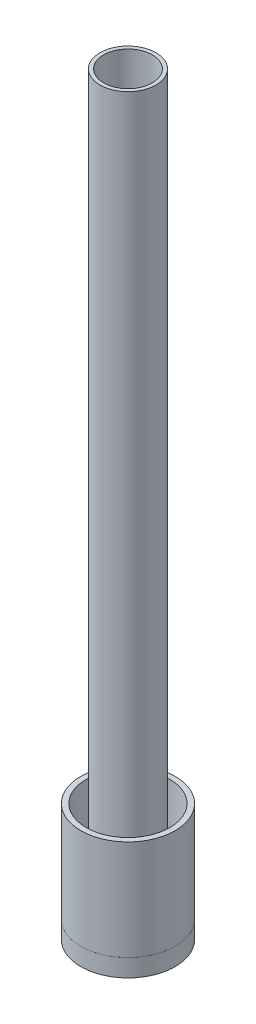
ISO-10303-21;
HEADER;
FILE_DESCRIPTION(('STEP AP214'),'2;1');
FILE_NAME('part.step','',(''),(''),'','','');
FILE_SCHEMA(('AUTOMOTIVE_DESIGN { 1 0 10303 214 1 1 1 1 }'));
ENDSEC;
DATA;
#1=APPLICATION_CONTEXT('core data for automotive mechanical design processes');
#2=APPLICATION_PROTOCOL_DEFINITION('international standard','automotive_design',2000,#1);
#3=PRODUCT_CONTEXT('',#1,'mechanical');
#4=PRODUCT('Part','Part','',(#3));
#5=PRODUCT_RELATED_PRODUCT_CATEGORY('part','',(#4));
#6=PRODUCT_DEFINITION_FORMATION('','',#4);
#7=PRODUCT_DEFINITION_CONTEXT('part definition',#1,'design');
#8=PRODUCT_DEFINITION('design','',#6,#7);
#9=PRODUCT_DEFINITION_SHAPE('','',#8);
#10=(LENGTH_UNIT() NAMED_UNIT(*) SI_UNIT(.MILLI.,.METRE.));
#11=(NAMED_UNIT(*) PLANE_ANGLE_UNIT() SI_UNIT($,.RADIAN.));
#12=(NAMED_UNIT(*) SI_UNIT($,.STERADIAN.) SOLID_ANGLE_UNIT());
#13=UNCERTAINTY_MEASURE_WITH_UNIT(LENGTH_MEASURE(1.E-05),#10,'distance_accuracy_value','');
#14=(GEOMETRIC_REPRESENTATION_CONTEXT(3) GLOBAL_UNCERTAINTY_ASSIGNED_CONTEXT((#13)) GLOBAL_UNIT_ASSIGNED_CONTEXT((#10,
#11,#12)) REPRESENTATION_CONTEXT('',''));
#15=CARTESIAN_POINT('',(0.,0.,0.));
#16=DIRECTION('',(0.,0.,1.));
#17=DIRECTION('',(1.,0.,0.));
#18=AXIS2_PLACEMENT_3D('',#15,#16,#17);
#19=CARTESIAN_POINT('',(-25.4,-67.0510410821472,0.));
#20=DIRECTION('',(0.,-1.,0.));
#21=DIRECTION('',(0.,0.,-1.));
#22=AXIS2_PLACEMENT_3D('',#19,#20,#21);
#23=CYLINDRICAL_SURFACE('',#22,7.14375);
#24=CARTESIAN_POINT('',(-25.4,-43.59275,0.));
#25=DIRECTION('',(0.,-1.,0.));
#26=DIRECTION('',(0.,0.,-1.));
#27=AXIS2_PLACEMENT_3D('',#24,#25,#26);
#28=CIRCLE('',#27,7.14375);
#29=CARTESIAN_POINT('',(-25.4,-43.59275,-7.14375));
#30=VERTEX_POINT('',#29);
#31=EDGE_CURVE('E12',#30,#30,#28,.T.);
#32=ORIENTED_EDGE('',*,*,#31,.T.);
#33=EDGE_LOOP('',(#32));
#34=FACE_BOUND('',#33,.T.);
#35=CARTESIAN_POINT('',(-25.4,-44.069,0.));
#36=DIRECTION('',(0.,-1.,0.));
#37=DIRECTION('',(0.,0.,-1.));
#38=AXIS2_PLACEMENT_3D('',#35,#36,#37);
#39=CIRCLE('',#38,7.14375);
#40=CARTESIAN_POINT('',(-25.4,-44.069,-7.14375));
#41=VERTEX_POINT('',#40);
#42=EDGE_CURVE('E100',#41,#41,#39,.T.);
#43=ORIENTED_EDGE('',*,*,#42,.F.);
#44=EDGE_LOOP('',(#43));
#45=FACE_BOUND('',#44,.T.);
#46=ADVANCED_FACE('F71',(#34,#45),#23,.T.);
#47=CARTESIAN_POINT('',(-25.4,-42.799,0.));
#48=DIRECTION('',(0.,-1.,0.));
#49=DIRECTION('',(0.,0.,-1.));
#50=AXIS2_PLACEMENT_3D('',#47,#48,#49);
#51=TOROIDAL_SURFACE('',#50,7.14375,0.793750000000003);
#52=CARTESIAN_POINT('',(-25.4,-42.00525,0.));
#53=DIRECTION('',(0.,-1.,0.));
#54=DIRECTION('',(0.,0.,-1.));
#55=AXIS2_PLACEMENT_3D('',#52,#53,#54);
#56=CIRCLE('',#55,7.14375);
#57=CARTESIAN_POINT('',(-25.4,-42.00525,-7.14375));
#58=VERTEX_POINT('',#57);
#59=EDGE_CURVE('E78',#58,#58,#56,.T.);
#60=ORIENTED_EDGE('',*,*,#59,.T.);
#61=EDGE_LOOP('',(#60));
#62=FACE_BOUND('',#61,.T.);
#63=ORIENTED_EDGE('',*,*,#31,.F.);
#64=EDGE_LOOP('',(#63));
#65=FACE_BOUND('',#64,.T.);
#66=ADVANCED_FACE('F73',(#62,#65),#51,.F.);
#67=CARTESIAN_POINT('',(-25.4,-34.19475,0.));
#68=DIRECTION('',(0.,-1.,0.));
#69=DIRECTION('',(0.,0.,-1.));
#70=AXIS2_PLACEMENT_3D('',#67,#68,#69);
#71=CIRCLE('',#70,7.14375);
#72=CARTESIAN_POINT('',(-25.4,-34.19475,-7.14375));
#73=VERTEX_POINT('',#72);
#74=EDGE_CURVE('E82',#73,#73,#71,.T.);
#75=ORIENTED_EDGE('',*,*,#74,.T.);
#76=EDGE_LOOP('',(#75));
#77=FACE_BOUND('',#76,.T.);
#78=ORIENTED_EDGE('',*,*,#59,.F.);
#79=EDGE_LOOP('',(#78));
#80=FACE_BOUND('',#79,.T.);
#81=ADVANCED_FACE('F109',(#77,#80),#23,.T.);
#82=CARTESIAN_POINT('',(-25.4,-33.401,0.));
#83=DIRECTION('',(0.,-1.,0.));
#84=DIRECTION('',(0.,0.,-1.));
#85=AXIS2_PLACEMENT_3D('',#82,#83,#84);
#86=TOROIDAL_SURFACE('',#85,7.14375,0.793750000000003);
#87=ORIENTED_EDGE('',*,*,#74,.F.);
#88=EDGE_LOOP('',(#87));
#89=FACE_BOUND('',#88,.T.);
#90=CARTESIAN_POINT('',(-25.4,-32.60725,0.));
#91=DIRECTION('',(0.,-1.,0.));
#92=DIRECTION('',(0.,0.,-1.));
#93=AXIS2_PLACEMENT_3D('',#90,#91,#92);
#94=CIRCLE('',#93,7.14375);
#95=CARTESIAN_POINT('',(-25.4,-32.60725,-7.14375));
#96=VERTEX_POINT('',#95);
#97=EDGE_CURVE('E86',#96,#96,#94,.T.);
#98=ORIENTED_EDGE('',*,*,#97,.T.);
#99=EDGE_LOOP('',(#98));
#100=FACE_BOUND('',#99,.T.);
#101=ADVANCED_FACE('F116',(#89,#100),#86,.F.);
#102=CARTESIAN_POINT('',(-25.4,-32.131,0.));
#103=DIRECTION('',(0.,-1.,0.));
#104=DIRECTION('',(0.,0.,-1.));
#105=AXIS2_PLACEMENT_3D('',#102,#103,#104);
#106=CIRCLE('',#105,7.14375);
#107=CARTESIAN_POINT('',(-25.4,-32.131,-7.14375));
#108=VERTEX_POINT('',#107);
#109=EDGE_CURVE('E91',#108,#108,#106,.T.);
#110=ORIENTED_EDGE('',*,*,#109,.T.);
#111=EDGE_LOOP('',(#110));
#112=FACE_BOUND('',#111,.T.);
#113=ORIENTED_EDGE('',*,*,#97,.F.);
#114=EDGE_LOOP('',(#113));
#115=FACE_BOUND('',#114,.T.);
#116=ADVANCED_FACE('F110',(#112,#115),#23,.T.);
#117=CARTESIAN_POINT('',(0.,-32.131,0.));
#118=DIRECTION('',(0.,1.,0.));
#119=DIRECTION('',(0.,0.,1.));
#120=AXIS2_PLACEMENT_3D('',#117,#118,#119);
#121=PLANE('',#120);
#122=ORIENTED_EDGE('',*,*,#109,.F.);
#123=EDGE_LOOP('',(#122));
#124=FACE_BOUND('',#123,.T.);
#125=ADVANCED_FACE('F119',(#124),#121,.T.);
#126=CARTESIAN_POINT('',(0.,-60.706,0.));
#127=DIRECTION('',(0.,1.,0.));
#128=DIRECTION('',(0.,0.,1.));
#129=AXIS2_PLACEMENT_3D('',#126,#127,#128);
#130=PLANE('',#129);
#131=CARTESIAN_POINT('',(-25.4,-60.706,0.));
#132=DIRECTION('',(0.,-1.,0.));
#133=DIRECTION('',(0.,0.,-1.));
#134=AXIS2_PLACEMENT_3D('',#131,#132,#133);
#135=CIRCLE('',#134,2.54);
#136=CARTESIAN_POINT('',(-25.4,-60.706,-2.54));
#137=VERTEX_POINT('',#136);
#138=EDGE_CURVE('E94',#137,#137,#135,.T.);
#139=ORIENTED_EDGE('',*,*,#138,.T.);
#140=EDGE_LOOP('',(#139));
#141=FACE_BOUND('',#140,.T.);
#142=ADVANCED_FACE('F125',(#141),#130,.F.);
#143=CARTESIAN_POINT('',(-25.4,-67.0510410821472,0.));
#144=DIRECTION('',(0.,-1.,0.));
#145=DIRECTION('',(0.,0.,-1.));
#146=AXIS2_PLACEMENT_3D('',#143,#144,#145);
#147=CYLINDRICAL_SURFACE('',#146,2.54);
#148=ORIENTED_EDGE('',*,*,#138,.F.);
#149=EDGE_LOOP('',(#148));
#150=FACE_BOUND('',#149,.T.);
#151=CARTESIAN_POINT('',(-25.4,-44.069,0.));
#152=DIRECTION('',(0.,-1.,0.));
#153=DIRECTION('',(0.,0.,-1.));
#154=AXIS2_PLACEMENT_3D('',#151,#152,#153);
#155=CIRCLE('',#154,2.54);
#156=CARTESIAN_POINT('',(-25.4,-44.069,-2.54));
#157=VERTEX_POINT('',#156);
#158=EDGE_CURVE('E97',#157,#157,#155,.T.);
#159=ORIENTED_EDGE('',*,*,#158,.T.);
#160=EDGE_LOOP('',(#159));
#161=FACE_BOUND('',#160,.T.);
#162=ADVANCED_FACE('F171',(#150,#161),#147,.T.);
#163=CARTESIAN_POINT('',(0.,-44.069,0.));
#164=DIRECTION('',(0.,-1.,0.));
#165=DIRECTION('',(0.,0.,-1.));
#166=AXIS2_PLACEMENT_3D('',#163,#164,#165);
#167=PLANE('',#166);
#168=ORIENTED_EDGE('',*,*,#42,.T.);
#169=EDGE_LOOP('',(#168));
#170=FACE_BOUND('',#169,.T.);
#171=ORIENTED_EDGE('',*,*,#158,.F.);
#172=EDGE_LOOP('',(#171));
#173=FACE_BOUND('',#172,.T.);
#174=ADVANCED_FACE('F104',(#170,#173),#167,.T.);
#175=CLOSED_SHELL('',(#46,#66,#81,#101,#116,#125,#142,#162,#174));
#176=MANIFOLD_SOLID_BREP('B2',#175);
#177=CARTESIAN_POINT('',(-25.4,2.50261469056597,0.));
#178=DIRECTION('',(0.,-1.,0.));
#179=DIRECTION('',(1.,0.,0.));
#180=AXIS2_PLACEMENT_3D('',#177,#178,#179);
#181=CYLINDRICAL_SURFACE('',#180,7.62);
#182=CARTESIAN_POINT('',(-25.4,-34.925,0.));
#183=DIRECTION('',(0.,-1.,0.));
#184=DIRECTION('',(1.,0.,0.));
#185=AXIS2_PLACEMENT_3D('',#182,#183,#184);
#186=CIRCLE('',#185,7.62);
#187=CARTESIAN_POINT('',(-29.21,-34.925,-6.59911357683743));
#188=VERTEX_POINT('',#187);
#189=CARTESIAN_POINT('',(-21.59,-34.925,-6.59911357683742));
#190=VERTEX_POINT('',#189);
#191=EDGE_CURVE('E313',#188,#190,#186,.T.);
#192=ORIENTED_EDGE('',*,*,#191,.T.);
#193=DIRECTION('',(0.,-1.,0.));
#194=VECTOR('',#193,1.);
#195=CARTESIAN_POINT('',(-21.59,-34.925,-6.59911357683742));
#196=LINE('',#195,#194);
#197=CARTESIAN_POINT('',(-21.59,-41.275,-6.59911357683742));
#198=VERTEX_POINT('',#197);
#199=EDGE_CURVE('E332',#190,#198,#196,.T.);
#200=ORIENTED_EDGE('',*,*,#199,.T.);
#201=CARTESIAN_POINT('',(-25.4,-41.275,0.));
#202=DIRECTION('',(0.,-1.,0.));
#203=DIRECTION('',(1.,0.,0.));
#204=AXIS2_PLACEMENT_3D('',#201,#202,#203);
#205=CIRCLE('',#204,7.62);
#206=CARTESIAN_POINT('',(-29.21,-41.275,-6.59911357683743));
#207=VERTEX_POINT('',#206);
#208=EDGE_CURVE('E323',#207,#198,#205,.T.);
#209=ORIENTED_EDGE('',*,*,#208,.F.);
#210=DIRECTION('',(0.,-1.,0.));
#211=VECTOR('',#210,1.);
#212=CARTESIAN_POINT('',(-29.21,-34.925,-6.59911357683743));
#213=LINE('',#212,#211);
#214=EDGE_CURVE('E330',#188,#207,#213,.T.);
#215=ORIENTED_EDGE('',*,*,#214,.F.);
#216=EDGE_LOOP('',(#192,#200,#209,#215));
#217=FACE_BOUND('',#216,.T.);
#218=CARTESIAN_POINT('',(-25.4,-50.8,0.));
#219=DIRECTION('',(0.,-1.,0.));
#220=DIRECTION('',(1.,0.,0.));
#221=AXIS2_PLACEMENT_3D('',#218,#219,#220);
#222=CIRCLE('',#221,7.62);
#223=CARTESIAN_POINT('',(-17.78,-50.8,0.));
#224=VERTEX_POINT('',#223);
#225=EDGE_CURVE('E341',#224,#224,#222,.T.);
#226=ORIENTED_EDGE('',*,*,#225,.T.);
#227=EDGE_LOOP('',(#226));
#228=FACE_BOUND('',#227,.T.);
#229=CARTESIAN_POINT('',(-25.4,-22.225,0.));
#230=DIRECTION('',(0.,1.,0.));
#231=DIRECTION('',(-1.,0.,0.));
#232=AXIS2_PLACEMENT_3D('',#229,#230,#231);
#233=CIRCLE('',#232,7.62);
#234=CARTESIAN_POINT('',(-33.02,-22.225,0.));
#235=VERTEX_POINT('',#234);
#236=EDGE_CURVE('E350',#235,#235,#233,.F.);
#237=ORIENTED_EDGE('',*,*,#236,.F.);
#238=EDGE_LOOP('',(#237));
#239=FACE_BOUND('',#238,.T.);
#240=CARTESIAN_POINT('',(-25.4,-34.925,0.));
#241=DIRECTION('',(0.,-1.,0.));
#242=DIRECTION('',(1.,0.,0.));
#243=AXIS2_PLACEMENT_3D('',#240,#241,#242);
#244=CIRCLE('',#243,7.62);
#245=CARTESIAN_POINT('',(-21.59,-34.925,6.59911357683742));
#246=VERTEX_POINT('',#245);
#247=CARTESIAN_POINT('',(-29.21,-34.925,6.59911357683743));
#248=VERTEX_POINT('',#247);
#249=EDGE_CURVE('E298',#246,#248,#244,.T.);
#250=ORIENTED_EDGE('',*,*,#249,.T.);
#251=DIRECTION('',(0.,-1.,0.));
#252=VECTOR('',#251,1.);
#253=CARTESIAN_POINT('',(-29.21,-34.925,6.59911357683743));
#254=LINE('',#253,#252);
#255=CARTESIAN_POINT('',(-29.21,-41.275,6.59911357683743));
#256=VERTEX_POINT('',#255);
#257=EDGE_CURVE('E297',#248,#256,#254,.T.);
#258=ORIENTED_EDGE('',*,*,#257,.T.);
#259=CARTESIAN_POINT('',(-25.4,-41.275,0.));
#260=DIRECTION('',(0.,-1.,0.));
#261=DIRECTION('',(1.,0.,0.));
#262=AXIS2_PLACEMENT_3D('',#259,#260,#261);
#263=CIRCLE('',#262,7.62);
#264=CARTESIAN_POINT('',(-21.59,-41.275,6.59911357683742));
#265=VERTEX_POINT('',#264);
#266=EDGE_CURVE('E430',#265,#256,#263,.T.);
#267=ORIENTED_EDGE('',*,*,#266,.F.);
#268=DIRECTION('',(0.,-1.,0.));
#269=VECTOR('',#268,1.);
#270=CARTESIAN_POINT('',(-21.59,-34.925,6.59911357683742));
#271=LINE('',#270,#269);
#272=EDGE_CURVE('E227',#246,#265,#271,.T.);
#273=ORIENTED_EDGE('',*,*,#272,.F.);
#274=EDGE_LOOP('',(#250,#258,#267,#273));
#275=FACE_BOUND('',#274,.T.);
#276=ADVANCED_FACE('F212',(#217,#228,#239,#275),#181,.F.);
#277=CARTESIAN_POINT('',(-25.4,-8.27369265471702,-15.24));
#278=DIRECTION('',(0.,-1.,0.));
#279=DIRECTION('',(1.,0.,0.));
#280=AXIS2_PLACEMENT_3D('',#277,#278,#279);
#281=CYLINDRICAL_SURFACE('',#280,3.81);
#282=CARTESIAN_POINT('',(-25.4,-19.05,-15.24));
#283=DIRECTION('',(0.,1.,0.));
#284=DIRECTION('',(-1.,0.,0.));
#285=AXIS2_PLACEMENT_3D('',#282,#283,#284);
#286=CIRCLE('',#285,3.81);
#287=CARTESIAN_POINT('',(-29.21,-19.05,-15.24));
#288=VERTEX_POINT('',#287);
#289=EDGE_CURVE('E338',#288,#288,#286,.F.);
#290=ORIENTED_EDGE('',*,*,#289,.F.);
#291=EDGE_LOOP('',(#290));
#292=FACE_BOUND('',#291,.T.);
#293=DIRECTION('',(0.,-1.,0.));
#294=VECTOR('',#293,1.);
#295=CARTESIAN_POINT('',(-29.21,-34.925,-15.24));
#296=LINE('',#295,#294);
#297=CARTESIAN_POINT('',(-29.21,-34.925,-15.24));
#298=VERTEX_POINT('',#297);
#299=CARTESIAN_POINT('',(-29.21,-41.275,-15.24));
#300=VERTEX_POINT('',#299);
#301=EDGE_CURVE('E326',#298,#300,#296,.T.);
#302=ORIENTED_EDGE('',*,*,#301,.T.);
#303=CARTESIAN_POINT('',(-25.4,-41.275,-15.24));
#304=DIRECTION('',(0.,-1.,0.));
#305=DIRECTION('',(1.,0.,0.));
#306=AXIS2_PLACEMENT_3D('',#303,#304,#305);
#307=CIRCLE('',#306,3.81);
#308=CARTESIAN_POINT('',(-21.59,-41.275,-15.24));
#309=VERTEX_POINT('',#308);
#310=EDGE_CURVE('E342',#300,#309,#307,.T.);
#311=ORIENTED_EDGE('',*,*,#310,.T.);
#312=DIRECTION('',(0.,-1.,0.));
#313=VECTOR('',#312,1.);
#314=CARTESIAN_POINT('',(-21.59,-34.925,-15.24));
#315=LINE('',#314,#313);
#316=CARTESIAN_POINT('',(-21.59,-34.925,-15.24));
#317=VERTEX_POINT('',#316);
#318=EDGE_CURVE('E319',#317,#309,#315,.T.);
#319=ORIENTED_EDGE('',*,*,#318,.F.);
#320=CARTESIAN_POINT('',(-25.4,-34.925,-15.24));
#321=DIRECTION('',(0.,-1.,0.));
#322=DIRECTION('',(1.,0.,0.));
#323=AXIS2_PLACEMENT_3D('',#320,#321,#322);
#324=CIRCLE('',#323,3.81);
#325=EDGE_CURVE('E308',#317,#298,#324,.T.);
#326=ORIENTED_EDGE('',*,*,#325,.T.);
#327=EDGE_LOOP('',(#302,#311,#319,#326));
#328=FACE_BOUND('',#327,.T.);
#329=ADVANCED_FACE('F405',(#292,#328),#281,.F.);
#330=CARTESIAN_POINT('',(-25.4,-8.27369265471702,15.24));
#331=DIRECTION('',(0.,-1.,0.));
#332=DIRECTION('',(1.,0.,0.));
#333=AXIS2_PLACEMENT_3D('',#330,#331,#332);
#334=CYLINDRICAL_SURFACE('',#333,3.81);
#335=CARTESIAN_POINT('',(-25.4,-19.05,15.24));
#336=DIRECTION('',(0.,1.,0.));
#337=DIRECTION('',(-1.,0.,0.));
#338=AXIS2_PLACEMENT_3D('',#335,#336,#337);
#339=CIRCLE('',#338,3.81);
#340=CARTESIAN_POINT('',(-29.21,-19.05,15.24));
#341=VERTEX_POINT('',#340);
#342=EDGE_CURVE('E337',#341,#341,#339,.F.);
#343=ORIENTED_EDGE('',*,*,#342,.F.);
#344=EDGE_LOOP('',(#343));
#345=FACE_BOUND('',#344,.T.);
#346=DIRECTION('',(0.,-1.,0.));
#347=VECTOR('',#346,1.);
#348=CARTESIAN_POINT('',(-21.59,-34.925,15.24));
#349=LINE('',#348,#347);
#350=CARTESIAN_POINT('',(-21.59,-34.925,15.24));
#351=VERTEX_POINT('',#350);
#352=CARTESIAN_POINT('',(-21.59,-41.275,15.24));
#353=VERTEX_POINT('',#352);
#354=EDGE_CURVE('E345',#351,#353,#349,.T.);
#355=ORIENTED_EDGE('',*,*,#354,.T.);
#356=CARTESIAN_POINT('',(-25.4,-41.275,15.24));
#357=DIRECTION('',(0.,-1.,0.));
#358=DIRECTION('',(1.,0.,0.));
#359=AXIS2_PLACEMENT_3D('',#356,#357,#358);
#360=CIRCLE('',#359,3.81);
#361=CARTESIAN_POINT('',(-29.21,-41.275,15.24));
#362=VERTEX_POINT('',#361);
#363=EDGE_CURVE('E302',#353,#362,#360,.T.);
#364=ORIENTED_EDGE('',*,*,#363,.T.);
#365=DIRECTION('',(0.,-1.,0.));
#366=VECTOR('',#365,1.);
#367=CARTESIAN_POINT('',(-29.21,-34.925,15.24));
#368=LINE('',#367,#366);
#369=CARTESIAN_POINT('',(-29.21,-34.925,15.24));
#370=VERTEX_POINT('',#369);
#371=EDGE_CURVE('E294',#370,#362,#368,.T.);
#372=ORIENTED_EDGE('',*,*,#371,.F.);
#373=CARTESIAN_POINT('',(-25.4,-34.925,15.24));
#374=DIRECTION('',(0.,-1.,0.));
#375=DIRECTION('',(1.,0.,0.));
#376=AXIS2_PLACEMENT_3D('',#373,#374,#375);
#377=CIRCLE('',#376,3.81);
#378=EDGE_CURVE('E277',#370,#351,#377,.T.);
#379=ORIENTED_EDGE('',*,*,#378,.T.);
#380=EDGE_LOOP('',(#355,#364,#372,#379));
#381=FACE_BOUND('',#380,.T.);
#382=ADVANCED_FACE('F300',(#345,#381),#334,.F.);
#383=CARTESIAN_POINT('',(0.,-22.86,0.));
#384=DIRECTION('',(0.,1.,0.));
#385=DIRECTION('',(-1.,0.,0.));
#386=AXIS2_PLACEMENT_3D('',#383,#384,#385);
#387=CONICAL_SURFACE('',#386,5.207,0.489957326253729);
#388=CARTESIAN_POINT('',(0.,-26.67,0.));
#389=DIRECTION('',(0.,1.,0.));
#390=DIRECTION('',(-1.,0.,0.));
#391=AXIS2_PLACEMENT_3D('',#388,#389,#390);
#392=CIRCLE('',#391,3.175);
#393=CARTESIAN_POINT('',(-3.175,-26.67,0.));
#394=VERTEX_POINT('',#393);
#395=EDGE_CURVE('E69',#394,#394,#392,.T.);
#396=ORIENTED_EDGE('',*,*,#395,.F.);
#397=EDGE_LOOP('',(#396));
#398=FACE_BOUND('',#397,.T.);
#399=CARTESIAN_POINT('',(0.,-22.86,0.));
#400=DIRECTION('',(0.,1.,0.));
#401=DIRECTION('',(-1.,0.,0.));
#402=AXIS2_PLACEMENT_3D('',#399,#400,#401);
#403=CIRCLE('',#402,5.207);
#404=CARTESIAN_POINT('',(-5.207,-22.86,0.));
#405=VERTEX_POINT('',#404);
#406=EDGE_CURVE('E353',#405,#405,#403,.T.);
#407=ORIENTED_EDGE('',*,*,#406,.T.);
#408=EDGE_LOOP('',(#407));
#409=FACE_BOUND('',#408,.T.);
#410=ADVANCED_FACE('F214',(#398,#409),#387,.F.);
#411=CARTESIAN_POINT('',(0.,0.,0.));
#412=DIRECTION('',(0.,1.,0.));
#413=DIRECTION('',(-1.,0.,0.));
#414=AXIS2_PLACEMENT_3D('',#411,#412,#413);
#415=CYLINDRICAL_SURFACE('',#414,3.175);
#416=CARTESIAN_POINT('',(0.,-50.8,0.));
#417=DIRECTION('',(0.,1.,0.));
#418=DIRECTION('',(-1.,0.,0.));
#419=AXIS2_PLACEMENT_3D('',#416,#417,#418);
#420=CIRCLE('',#419,3.175);
#421=CARTESIAN_POINT('',(-3.175,-50.8,0.));
#422=VERTEX_POINT('',#421);
#423=EDGE_CURVE('E220',#422,#422,#420,.T.);
#424=ORIENTED_EDGE('',*,*,#423,.F.);
#425=EDGE_LOOP('',(#424));
#426=FACE_BOUND('',#425,.T.);
#427=ORIENTED_EDGE('',*,*,#395,.T.);
#428=EDGE_LOOP('',(#427));
#429=FACE_BOUND('',#428,.T.);
#430=ADVANCED_FACE('F376',(#426,#429),#415,.F.);
#431=CARTESIAN_POINT('',(0.,-50.8,0.));
#432=DIRECTION('',(0.,-1.,0.));
#433=DIRECTION('',(1.,0.,0.));
#434=AXIS2_PLACEMENT_3D('',#431,#432,#433);
#435=PLANE('',#434);
#436=ORIENTED_EDGE('',*,*,#225,.F.);
#437=EDGE_LOOP('',(#436));
#438=FACE_BOUND('',#437,.T.);
#439=ORIENTED_EDGE('',*,*,#423,.T.);
#440=EDGE_LOOP('',(#439));
#441=FACE_BOUND('',#440,.T.);
#442=CARTESIAN_POINT('',(0.,-50.8,0.));
#443=DIRECTION('',(0.,1.,0.));
#444=DIRECTION('',(-1.,0.,0.));
#445=AXIS2_PLACEMENT_3D('',#442,#443,#444);
#446=CIRCLE('',#445,50.8);
#447=CARTESIAN_POINT('',(-50.8,-50.8,0.));
#448=VERTEX_POINT('',#447);
#449=EDGE_CURVE('E368',#448,#448,#446,.T.);
#450=ORIENTED_EDGE('',*,*,#449,.F.);
#451=EDGE_LOOP('',(#450));
#452=FACE_BOUND('',#451,.T.);
#453=ADVANCED_FACE('F373',(#438,#441,#452),#435,.T.);
#454=CARTESIAN_POINT('',(0.,0.,0.));
#455=DIRECTION('',(0.,1.,0.));
#456=DIRECTION('',(-1.,0.,0.));
#457=AXIS2_PLACEMENT_3D('',#454,#455,#456);
#458=CYLINDRICAL_SURFACE('',#457,50.8);
#459=ORIENTED_EDGE('',*,*,#449,.T.);
#460=EDGE_LOOP('',(#459));
#461=FACE_BOUND('',#460,.T.);
#462=CARTESIAN_POINT('',(0.,-31.75,0.));
#463=DIRECTION('',(0.,1.,0.));
#464=DIRECTION('',(-1.,0.,0.));
#465=AXIS2_PLACEMENT_3D('',#462,#463,#464);
#466=CIRCLE('',#465,50.8);
#467=CARTESIAN_POINT('',(-50.8,-31.75,0.));
#468=VERTEX_POINT('',#467);
#469=EDGE_CURVE('E365',#468,#468,#466,.T.);
#470=ORIENTED_EDGE('',*,*,#469,.F.);
#471=EDGE_LOOP('',(#470));
#472=FACE_BOUND('',#471,.T.);
#473=ADVANCED_FACE('F480',(#461,#472),#458,.T.);
#474=CARTESIAN_POINT('',(0.,-31.75,0.));
#475=DIRECTION('',(0.,1.,0.));
#476=DIRECTION('',(-1.,0.,0.));
#477=AXIS2_PLACEMENT_3D('',#474,#475,#476);
#478=PLANE('',#477);
#479=ORIENTED_EDGE('',*,*,#469,.T.);
#480=EDGE_LOOP('',(#479));
#481=FACE_BOUND('',#480,.T.);
#482=CARTESIAN_POINT('',(0.,-31.75,0.));
#483=DIRECTION('',(0.,1.,0.));
#484=DIRECTION('',(-1.,0.,0.));
#485=AXIS2_PLACEMENT_3D('',#482,#483,#484);
#486=CIRCLE('',#485,44.9096);
#487=CARTESIAN_POINT('',(-44.9096,-31.75,0.));
#488=VERTEX_POINT('',#487);
#489=EDGE_CURVE('E362',#488,#488,#486,.T.);
#490=ORIENTED_EDGE('',*,*,#489,.F.);
#491=EDGE_LOOP('',(#490));
#492=FACE_BOUND('',#491,.T.);
#493=ADVANCED_FACE('F400',(#481,#492),#478,.T.);
#494=CARTESIAN_POINT('',(0.,0.,0.));
#495=DIRECTION('',(0.,1.,0.));
#496=DIRECTION('',(-1.,0.,0.));
#497=AXIS2_PLACEMENT_3D('',#494,#495,#496);
#498=CYLINDRICAL_SURFACE('',#497,44.9096);
#499=ORIENTED_EDGE('',*,*,#489,.T.);
#500=EDGE_LOOP('',(#499));
#501=FACE_BOUND('',#500,.T.);
#502=CARTESIAN_POINT('',(0.,-19.05,0.));
#503=DIRECTION('',(0.,1.,0.));
#504=DIRECTION('',(-1.,0.,0.));
#505=AXIS2_PLACEMENT_3D('',#502,#503,#504);
#506=CIRCLE('',#505,44.9096);
#507=CARTESIAN_POINT('',(-44.9096,-19.05,0.));
#508=VERTEX_POINT('',#507);
#509=EDGE_CURVE('E359',#508,#508,#506,.T.);
#510=ORIENTED_EDGE('',*,*,#509,.F.);
#511=EDGE_LOOP('',(#510));
#512=FACE_BOUND('',#511,.T.);
#513=ADVANCED_FACE('F394',(#501,#512),#498,.T.);
#514=CARTESIAN_POINT('',(0.,-19.05,0.));
#515=DIRECTION('',(0.,1.,0.));
#516=DIRECTION('',(-1.,0.,0.));
#517=AXIS2_PLACEMENT_3D('',#514,#515,#516);
#518=PLANE('',#517);
#519=ORIENTED_EDGE('',*,*,#342,.T.);
#520=EDGE_LOOP('',(#519));
#521=FACE_BOUND('',#520,.T.);
#522=ORIENTED_EDGE('',*,*,#289,.T.);
#523=EDGE_LOOP('',(#522));
#524=FACE_BOUND('',#523,.T.);
#525=ORIENTED_EDGE('',*,*,#509,.T.);
#526=EDGE_LOOP('',(#525));
#527=FACE_BOUND('',#526,.T.);
#528=CARTESIAN_POINT('',(0.,-19.05,0.));
#529=DIRECTION('',(0.,1.,0.));
#530=DIRECTION('',(-1.,0.,0.));
#531=AXIS2_PLACEMENT_3D('',#528,#529,#530);
#532=CIRCLE('',#531,5.207);
#533=CARTESIAN_POINT('',(-5.207,-19.05,0.));
#534=VERTEX_POINT('',#533);
#535=EDGE_CURVE('E356',#534,#534,#532,.T.);
#536=ORIENTED_EDGE('',*,*,#535,.F.);
#537=EDGE_LOOP('',(#536));
#538=FACE_BOUND('',#537,.T.);
#539=ADVANCED_FACE('F389',(#521,#524,#527,#538),#518,.T.);
#540=CARTESIAN_POINT('',(0.,0.,0.));
#541=DIRECTION('',(0.,1.,0.));
#542=DIRECTION('',(-1.,0.,0.));
#543=AXIS2_PLACEMENT_3D('',#540,#541,#542);
#544=CYLINDRICAL_SURFACE('',#543,5.207);
#545=ORIENTED_EDGE('',*,*,#406,.F.);
#546=EDGE_LOOP('',(#545));
#547=FACE_BOUND('',#546,.T.);
#548=ORIENTED_EDGE('',*,*,#535,.T.);
#549=EDGE_LOOP('',(#548));
#550=FACE_BOUND('',#549,.T.);
#551=ADVANCED_FACE('F385',(#547,#550),#544,.F.);
#552=CARTESIAN_POINT('',(0.,-22.225,0.));
#553=DIRECTION('',(0.,1.,0.));
#554=DIRECTION('',(-1.,0.,0.));
#555=AXIS2_PLACEMENT_3D('',#552,#553,#554);
#556=PLANE('',#555);
#557=ORIENTED_EDGE('',*,*,#236,.T.);
#558=EDGE_LOOP('',(#557));
#559=FACE_BOUND('',#558,.T.);
#560=ADVANCED_FACE('F388',(#559),#556,.F.);
#561=CARTESIAN_POINT('',(0.,-41.275,0.));
#562=DIRECTION('',(0.,-1.,0.));
#563=DIRECTION('',(1.,0.,0.));
#564=AXIS2_PLACEMENT_3D('',#561,#562,#563);
#565=PLANE('',#564);
#566=ORIENTED_EDGE('',*,*,#310,.F.);
#567=DIRECTION('',(0.,0.,-1.));
#568=VECTOR('',#567,1.);
#569=CARTESIAN_POINT('',(-29.21,-41.275,0.));
#570=LINE('',#569,#568);
#571=EDGE_CURVE('E235',#207,#300,#570,.T.);
#572=ORIENTED_EDGE('',*,*,#571,.F.);
#573=ORIENTED_EDGE('',*,*,#208,.T.);
#574=DIRECTION('',(0.,0.,-1.));
#575=VECTOR('',#574,1.);
#576=CARTESIAN_POINT('',(-21.59,-41.275,0.));
#577=LINE('',#576,#575);
#578=EDGE_CURVE('E320',#198,#309,#577,.T.);
#579=ORIENTED_EDGE('',*,*,#578,.T.);
#580=EDGE_LOOP('',(#566,#572,#573,#579));
#581=FACE_BOUND('',#580,.T.);
#582=ADVANCED_FACE('F417',(#581),#565,.F.);
#583=CARTESIAN_POINT('',(0.,-41.275,0.));
#584=DIRECTION('',(0.,-1.,0.));
#585=DIRECTION('',(1.,0.,0.));
#586=AXIS2_PLACEMENT_3D('',#583,#584,#585);
#587=PLANE('',#586);
#588=ORIENTED_EDGE('',*,*,#363,.F.);
#589=DIRECTION('',(0.,0.,-1.));
#590=VECTOR('',#589,1.);
#591=CARTESIAN_POINT('',(-21.59,-41.275,0.));
#592=LINE('',#591,#590);
#593=EDGE_CURVE('E288',#353,#265,#592,.T.);
#594=ORIENTED_EDGE('',*,*,#593,.T.);
#595=ORIENTED_EDGE('',*,*,#266,.T.);
#596=DIRECTION('',(0.,0.,-1.));
#597=VECTOR('',#596,1.);
#598=CARTESIAN_POINT('',(-29.21,-41.275,0.));
#599=LINE('',#598,#597);
#600=EDGE_CURVE('E329',#362,#256,#599,.T.);
#601=ORIENTED_EDGE('',*,*,#600,.F.);
#602=EDGE_LOOP('',(#588,#594,#595,#601));
#603=FACE_BOUND('',#602,.T.);
#604=ADVANCED_FACE('F422',(#603),#587,.F.);
#605=CARTESIAN_POINT('',(-21.59,-34.925,0.));
#606=DIRECTION('',(-1.,0.,0.));
#607=DIRECTION('',(0.,0.,1.));
#608=AXIS2_PLACEMENT_3D('',#605,#606,#607);
#609=PLANE('',#608);
#610=ORIENTED_EDGE('',*,*,#593,.F.);
#611=ORIENTED_EDGE('',*,*,#354,.F.);
#612=DIRECTION('',(0.,0.,-1.));
#613=VECTOR('',#612,1.);
#614=CARTESIAN_POINT('',(-21.59,-34.925,0.));
#615=LINE('',#614,#613);
#616=EDGE_CURVE('E283',#351,#246,#615,.T.);
#617=ORIENTED_EDGE('',*,*,#616,.T.);
#618=ORIENTED_EDGE('',*,*,#272,.T.);
#619=EDGE_LOOP('',(#610,#611,#617,#618));
#620=FACE_BOUND('',#619,.T.);
#621=ADVANCED_FACE('F434',(#620),#609,.T.);
#622=CARTESIAN_POINT('',(-29.21,-34.925,0.));
#623=DIRECTION('',(-1.,0.,0.));
#624=DIRECTION('',(0.,0.,1.));
#625=AXIS2_PLACEMENT_3D('',#622,#623,#624);
#626=PLANE('',#625);
#627=ORIENTED_EDGE('',*,*,#600,.T.);
#628=ORIENTED_EDGE('',*,*,#257,.F.);
#629=DIRECTION('',(0.,0.,-1.));
#630=VECTOR('',#629,1.);
#631=CARTESIAN_POINT('',(-29.21,-34.925,0.));
#632=LINE('',#631,#630);
#633=EDGE_CURVE('E281',#370,#248,#632,.T.);
#634=ORIENTED_EDGE('',*,*,#633,.F.);
#635=ORIENTED_EDGE('',*,*,#371,.T.);
#636=EDGE_LOOP('',(#627,#628,#634,#635));
#637=FACE_BOUND('',#636,.T.);
#638=ADVANCED_FACE('F293',(#637),#626,.F.);
#639=CARTESIAN_POINT('',(0.,-34.925,0.));
#640=DIRECTION('',(0.,-1.,0.));
#641=DIRECTION('',(1.,0.,0.));
#642=AXIS2_PLACEMENT_3D('',#639,#640,#641);
#643=PLANE('',#642);
#644=ORIENTED_EDGE('',*,*,#378,.F.);
#645=ORIENTED_EDGE('',*,*,#633,.T.);
#646=ORIENTED_EDGE('',*,*,#249,.F.);
#647=ORIENTED_EDGE('',*,*,#616,.F.);
#648=EDGE_LOOP('',(#644,#645,#646,#647));
#649=FACE_BOUND('',#648,.T.);
#650=ADVANCED_FACE('F279',(#649),#643,.T.);
#651=CARTESIAN_POINT('',(-29.21,-34.925,0.));
#652=DIRECTION('',(-1.,0.,0.));
#653=DIRECTION('',(0.,0.,1.));
#654=AXIS2_PLACEMENT_3D('',#651,#652,#653);
#655=PLANE('',#654);
#656=ORIENTED_EDGE('',*,*,#571,.T.);
#657=ORIENTED_EDGE('',*,*,#301,.F.);
#658=DIRECTION('',(0.,0.,-1.));
#659=VECTOR('',#658,1.);
#660=CARTESIAN_POINT('',(-29.21,-34.925,0.));
#661=LINE('',#660,#659);
#662=EDGE_CURVE('E316',#188,#298,#661,.T.);
#663=ORIENTED_EDGE('',*,*,#662,.F.);
#664=ORIENTED_EDGE('',*,*,#214,.T.);
#665=EDGE_LOOP('',(#656,#657,#663,#664));
#666=FACE_BOUND('',#665,.T.);
#667=ADVANCED_FACE('F450',(#666),#655,.F.);
#668=CARTESIAN_POINT('',(-21.59,-34.925,0.));
#669=DIRECTION('',(-1.,0.,0.));
#670=DIRECTION('',(0.,-1.,0.));
#671=AXIS2_PLACEMENT_3D('',#668,#669,#670);
#672=PLANE('',#671);
#673=ORIENTED_EDGE('',*,*,#578,.F.);
#674=ORIENTED_EDGE('',*,*,#199,.F.);
#675=DIRECTION('',(0.,0.,-1.));
#676=VECTOR('',#675,1.);
#677=CARTESIAN_POINT('',(-21.59,-34.925,0.));
#678=LINE('',#677,#676);
#679=EDGE_CURVE('E311',#190,#317,#678,.T.);
#680=ORIENTED_EDGE('',*,*,#679,.T.);
#681=ORIENTED_EDGE('',*,*,#318,.T.);
#682=EDGE_LOOP('',(#673,#674,#680,#681));
#683=FACE_BOUND('',#682,.T.);
#684=ADVANCED_FACE('F448',(#683),#672,.T.);
#685=CARTESIAN_POINT('',(0.,-34.925,0.));
#686=DIRECTION('',(0.,-1.,0.));
#687=DIRECTION('',(1.,0.,0.));
#688=AXIS2_PLACEMENT_3D('',#685,#686,#687);
#689=PLANE('',#688);
#690=ORIENTED_EDGE('',*,*,#325,.F.);
#691=ORIENTED_EDGE('',*,*,#679,.F.);
#692=ORIENTED_EDGE('',*,*,#191,.F.);
#693=ORIENTED_EDGE('',*,*,#662,.T.);
#694=EDGE_LOOP('',(#690,#691,#692,#693));
#695=FACE_BOUND('',#694,.T.);
#696=ADVANCED_FACE('F445',(#695),#689,.T.);
#697=CLOSED_SHELL('',(#276,#329,#382,#410,#430,#453,#473,#493,#513,#539,#551,#560,#582,#604,
#621,#638,#650,#667,#684,#696));
#698=MANIFOLD_SOLID_BREP('B7',#697);
#699=CARTESIAN_POINT('',(0.,-9.92726371364929,0.));
#700=DIRECTION('',(0.,-1.,0.));
#701=DIRECTION('',(1.,0.,0.));
#702=AXIS2_PLACEMENT_3D('',#699,#700,#701);
#703=CONICAL_SURFACE('',#702,43.8615743878931,0.785398163397445);
#704=CARTESIAN_POINT('',(0.,-10.8252893257562,0.));
#705=DIRECTION('',(0.,1.,0.));
#706=DIRECTION('',(-1.,0.,0.));
#707=AXIS2_PLACEMENT_3D('',#704,#705,#706);
#708=CIRCLE('',#707,44.7596);
#709=CARTESIAN_POINT('',(-44.7596,-10.8252893257562,0.));
#710=VERTEX_POINT('',#709);
#711=EDGE_CURVE('E646',#710,#710,#708,.T.);
#712=ORIENTED_EDGE('',*,*,#711,.T.);
#713=EDGE_LOOP('',(#712));
#714=FACE_BOUND('',#713,.T.);
#715=CARTESIAN_POINT('',(0.,-9.92726371364929,0.));
#716=DIRECTION('',(0.,1.,0.));
#717=DIRECTION('',(-1.,0.,0.));
#718=AXIS2_PLACEMENT_3D('',#715,#716,#717);
#719=CIRCLE('',#718,43.8615743878931);
#720=CARTESIAN_POINT('',(-43.8615743878931,-9.92726371364929,0.));
#721=VERTEX_POINT('',#720);
#722=EDGE_CURVE('E211',#721,#721,#719,.T.);
#723=ORIENTED_EDGE('',*,*,#722,.F.);
#724=EDGE_LOOP('',(#723));
#725=FACE_BOUND('',#724,.T.);
#726=ADVANCED_FACE('F618',(#714,#725),#703,.T.);
#727=CARTESIAN_POINT('',(0.,-9.02923810154238,0.));
#728=DIRECTION('',(0.,1.,0.));
#729=DIRECTION('',(-1.,0.,0.));
#730=AXIS2_PLACEMENT_3D('',#727,#728,#729);
#731=CONICAL_SURFACE('',#730,44.7596,0.785398163397446);
#732=ORIENTED_EDGE('',*,*,#722,.T.);
#733=EDGE_LOOP('',(#732));
#734=FACE_BOUND('',#733,.T.);
#735=CARTESIAN_POINT('',(0.,-9.02923810154238,0.));
#736=DIRECTION('',(0.,1.,0.));
#737=DIRECTION('',(-1.,0.,0.));
#738=AXIS2_PLACEMENT_3D('',#735,#736,#737);
#739=CIRCLE('',#738,44.7596);
#740=CARTESIAN_POINT('',(-44.7596,-9.02923810154238,0.));
#741=VERTEX_POINT('',#740);
#742=EDGE_CURVE('E624',#741,#741,#739,.T.);
#743=ORIENTED_EDGE('',*,*,#742,.F.);
#744=EDGE_LOOP('',(#743));
#745=FACE_BOUND('',#744,.T.);
#746=ADVANCED_FACE('F669',(#734,#745),#731,.T.);
#747=CARTESIAN_POINT('',(0.,0.,0.));
#748=DIRECTION('',(0.,1.,0.));
#749=DIRECTION('',(-1.,0.,0.));
#750=AXIS2_PLACEMENT_3D('',#747,#748,#749);
#751=CYLINDRICAL_SURFACE('',#750,44.7596);
#752=ORIENTED_EDGE('',*,*,#742,.T.);
#753=EDGE_LOOP('',(#752));
#754=FACE_BOUND('',#753,.T.);
#755=CARTESIAN_POINT('',(0.,-3.67076189845762,0.));
#756=DIRECTION('',(0.,1.,0.));
#757=DIRECTION('',(-1.,0.,0.));
#758=AXIS2_PLACEMENT_3D('',#755,#756,#757);
#759=CIRCLE('',#758,44.7596);
#760=CARTESIAN_POINT('',(-44.7596,-3.67076189845762,0.));
#761=VERTEX_POINT('',#760);
#762=EDGE_CURVE('E628',#761,#761,#759,.T.);
#763=ORIENTED_EDGE('',*,*,#762,.F.);
#764=EDGE_LOOP('',(#763));
#765=FACE_BOUND('',#764,.T.);
#766=ADVANCED_FACE('F673',(#754,#765),#751,.T.);
#767=CARTESIAN_POINT('',(0.,-2.7727362863507,0.));
#768=DIRECTION('',(0.,-1.,0.));
#769=DIRECTION('',(1.,0.,0.));
#770=AXIS2_PLACEMENT_3D('',#767,#768,#769);
#771=CONICAL_SURFACE('',#770,43.8615743878931,0.785398163397446);
#772=ORIENTED_EDGE('',*,*,#762,.T.);
#773=EDGE_LOOP('',(#772));
#774=FACE_BOUND('',#773,.T.);
#775=CARTESIAN_POINT('',(0.,-2.7727362863507,0.));
#776=DIRECTION('',(0.,1.,0.));
#777=DIRECTION('',(-1.,0.,0.));
#778=AXIS2_PLACEMENT_3D('',#775,#776,#777);
#779=CIRCLE('',#778,43.8615743878931);
#780=CARTESIAN_POINT('',(-43.8615743878931,-2.7727362863507,0.));
#781=VERTEX_POINT('',#780);
#782=EDGE_CURVE('E632',#781,#781,#779,.T.);
#783=ORIENTED_EDGE('',*,*,#782,.F.);
#784=EDGE_LOOP('',(#783));
#785=FACE_BOUND('',#784,.T.);
#786=ADVANCED_FACE('F677',(#774,#785),#771,.T.);
#787=CARTESIAN_POINT('',(0.,-1.87471067424379,0.));
#788=DIRECTION('',(0.,1.,0.));
#789=DIRECTION('',(-1.,0.,0.));
#790=AXIS2_PLACEMENT_3D('',#787,#788,#789);
#791=CONICAL_SURFACE('',#790,44.7596,0.785398163397444);
#792=ORIENTED_EDGE('',*,*,#782,.T.);
#793=EDGE_LOOP('',(#792));
#794=FACE_BOUND('',#793,.T.);
#795=CARTESIAN_POINT('',(0.,-1.87471067424379,0.));
#796=DIRECTION('',(0.,1.,0.));
#797=DIRECTION('',(-1.,0.,0.));
#798=AXIS2_PLACEMENT_3D('',#795,#796,#797);
#799=CIRCLE('',#798,44.7596);
#800=CARTESIAN_POINT('',(-44.7596,-1.87471067424379,0.));
#801=VERTEX_POINT('',#800);
#802=EDGE_CURVE('E637',#801,#801,#799,.T.);
#803=ORIENTED_EDGE('',*,*,#802,.F.);
#804=EDGE_LOOP('',(#803));
#805=FACE_BOUND('',#804,.T.);
#806=ADVANCED_FACE('F683',(#794,#805),#791,.T.);
#807=CARTESIAN_POINT('',(0.,0.,0.));
#808=DIRECTION('',(0.,1.,0.));
#809=DIRECTION('',(-1.,0.,0.));
#810=AXIS2_PLACEMENT_3D('',#807,#808,#809);
#811=CYLINDRICAL_SURFACE('',#810,44.7596);
#812=ORIENTED_EDGE('',*,*,#802,.T.);
#813=EDGE_LOOP('',(#812));
#814=FACE_BOUND('',#813,.T.);
#815=CARTESIAN_POINT('',(0.,0.,0.));
#816=DIRECTION('',(0.,1.,0.));
#817=DIRECTION('',(-1.,0.,0.));
#818=AXIS2_PLACEMENT_3D('',#815,#816,#817);
#819=CIRCLE('',#818,44.7596);
#820=CARTESIAN_POINT('',(-44.7596,0.,0.));
#821=VERTEX_POINT('',#820);
#822=EDGE_CURVE('E640',#821,#821,#819,.T.);
#823=ORIENTED_EDGE('',*,*,#822,.F.);
#824=EDGE_LOOP('',(#823));
#825=FACE_BOUND('',#824,.T.);
#826=ADVANCED_FACE('F665',(#814,#825),#811,.T.);
#827=CARTESIAN_POINT('',(0.,0.,0.));
#828=DIRECTION('',(0.,-1.,0.));
#829=DIRECTION('',(1.,0.,0.));
#830=AXIS2_PLACEMENT_3D('',#827,#828,#829);
#831=PLANE('',#830);
#832=ORIENTED_EDGE('',*,*,#822,.T.);
#833=EDGE_LOOP('',(#832));
#834=FACE_BOUND('',#833,.T.);
#835=ADVANCED_FACE('F660',(#834),#831,.F.);
#836=CARTESIAN_POINT('',(0.,-12.7,0.));
#837=DIRECTION('',(0.,-1.,0.));
#838=DIRECTION('',(1.,0.,0.));
#839=AXIS2_PLACEMENT_3D('',#836,#837,#838);
#840=PLANE('',#839);
#841=CARTESIAN_POINT('',(0.,-12.7,0.));
#842=DIRECTION('',(0.,1.,0.));
#843=DIRECTION('',(-1.,0.,0.));
#844=AXIS2_PLACEMENT_3D('',#841,#842,#843);
#845=CIRCLE('',#844,44.7596);
#846=CARTESIAN_POINT('',(-44.7596,-12.7,0.));
#847=VERTEX_POINT('',#846);
#848=EDGE_CURVE('E643',#847,#847,#845,.T.);
#849=ORIENTED_EDGE('',*,*,#848,.F.);
#850=EDGE_LOOP('',(#849));
#851=FACE_BOUND('',#850,.T.);
#852=ADVANCED_FACE('F655',(#851),#840,.T.);
#853=CARTESIAN_POINT('',(0.,0.,0.));
#854=DIRECTION('',(0.,1.,0.));
#855=DIRECTION('',(-1.,0.,0.));
#856=AXIS2_PLACEMENT_3D('',#853,#854,#855);
#857=CYLINDRICAL_SURFACE('',#856,44.7596);
#858=ORIENTED_EDGE('',*,*,#711,.F.);
#859=EDGE_LOOP('',(#858));
#860=FACE_BOUND('',#859,.T.);
#861=ORIENTED_EDGE('',*,*,#848,.T.);
#862=EDGE_LOOP('',(#861));
#863=FACE_BOUND('',#862,.T.);
#864=ADVANCED_FACE('F652',(#860,#863),#857,.T.);
#865=CLOSED_SHELL('',(#726,#746,#766,#786,#806,#826,#835,#852,#864));
#866=MANIFOLD_SOLID_BREP('B63',#865);
#867=CARTESIAN_POINT('',(0.,-31.75,0.));
#868=DIRECTION('',(0.,1.,0.));
#869=DIRECTION('',(0.,0.,1.));
#870=AXIS2_PLACEMENT_3D('',#867,#868,#869);
#871=CYLINDRICAL_SURFACE('',#870,50.8);
#872=CARTESIAN_POINT('',(0.,-31.75,0.));
#873=DIRECTION('',(0.,1.,0.));
#874=DIRECTION('',(0.,0.,1.));
#875=AXIS2_PLACEMENT_3D('',#872,#873,#874);
#876=CIRCLE('',#875,50.8);
#877=CARTESIAN_POINT('',(0.,-31.75,50.8));
#878=VERTEX_POINT('',#877);
#879=EDGE_CURVE('E617',#878,#878,#876,.T.);
#880=ORIENTED_EDGE('',*,*,#879,.T.);
#881=EDGE_LOOP('',(#880));
#882=FACE_BOUND('',#881,.T.);
#883=CARTESIAN_POINT('',(0.,76.2,0.));
#884=DIRECTION('',(0.,1.,0.));
#885=DIRECTION('',(0.,0.,1.));
#886=AXIS2_PLACEMENT_3D('',#883,#884,#885);
#887=CIRCLE('',#886,50.8);
#888=CARTESIAN_POINT('',(0.,76.2,50.8));
#889=VERTEX_POINT('',#888);
#890=EDGE_CURVE('E766',#889,#889,#887,.T.);
#891=ORIENTED_EDGE('',*,*,#890,.F.);
#892=EDGE_LOOP('',(#891));
#893=FACE_BOUND('',#892,.T.);
#894=ADVANCED_FACE('F756',(#882,#893),#871,.T.);
#895=CARTESIAN_POINT('',(0.,-31.75,0.));
#896=DIRECTION('',(0.,1.,0.));
#897=DIRECTION('',(0.,0.,1.));
#898=AXIS2_PLACEMENT_3D('',#895,#896,#897);
#899=PLANE('',#898);
#900=CARTESIAN_POINT('',(0.,-31.75,0.));
#901=DIRECTION('',(0.,1.,0.));
#902=DIRECTION('',(0.,0.,1.));
#903=AXIS2_PLACEMENT_3D('',#900,#901,#902);
#904=CIRCLE('',#903,45.0596);
#905=CARTESIAN_POINT('',(0.,-31.75,45.0596));
#906=VERTEX_POINT('',#905);
#907=EDGE_CURVE('E762',#906,#906,#904,.T.);
#908=ORIENTED_EDGE('',*,*,#907,.T.);
#909=EDGE_LOOP('',(#908));
#910=FACE_BOUND('',#909,.T.);
#911=ORIENTED_EDGE('',*,*,#879,.F.);
#912=EDGE_LOOP('',(#911));
#913=FACE_BOUND('',#912,.T.);
#914=ADVANCED_FACE('F785',(#910,#913),#899,.F.);
#915=CARTESIAN_POINT('',(0.,-31.75,0.));
#916=DIRECTION('',(0.,1.,0.));
#917=DIRECTION('',(0.,0.,1.));
#918=AXIS2_PLACEMENT_3D('',#915,#916,#917);
#919=CYLINDRICAL_SURFACE('',#918,45.0596);
#920=ORIENTED_EDGE('',*,*,#907,.F.);
#921=EDGE_LOOP('',(#920));
#922=FACE_BOUND('',#921,.T.);
#923=CARTESIAN_POINT('',(0.,76.2,0.));
#924=DIRECTION('',(0.,1.,0.));
#925=DIRECTION('',(0.,0.,1.));
#926=AXIS2_PLACEMENT_3D('',#923,#924,#925);
#927=CIRCLE('',#926,45.0596);
#928=CARTESIAN_POINT('',(0.,76.2,45.0596));
#929=VERTEX_POINT('',#928);
#930=EDGE_CURVE('E770',#929,#929,#927,.T.);
#931=ORIENTED_EDGE('',*,*,#930,.T.);
#932=EDGE_LOOP('',(#931));
#933=FACE_BOUND('',#932,.T.);
#934=ADVANCED_FACE('F776',(#922,#933),#919,.F.);
#935=CARTESIAN_POINT('',(0.,76.2,0.));
#936=DIRECTION('',(0.,1.,0.));
#937=DIRECTION('',(0.,0.,1.));
#938=AXIS2_PLACEMENT_3D('',#935,#936,#937);
#939=PLANE('',#938);
#940=ORIENTED_EDGE('',*,*,#890,.T.);
#941=EDGE_LOOP('',(#940));
#942=FACE_BOUND('',#941,.T.);
#943=ORIENTED_EDGE('',*,*,#930,.F.);
#944=EDGE_LOOP('',(#943));
#945=FACE_BOUND('',#944,.T.);
#946=ADVANCED_FACE('F778',(#942,#945),#939,.T.);
#947=CLOSED_SHELL('',(#894,#914,#934,#946));
#948=MANIFOLD_SOLID_BREP('B206',#947);
#949=CARTESIAN_POINT('',(0.,762.,0.));
#950=DIRECTION('',(0.,1.,0.));
#951=DIRECTION('',(0.,0.,1.));
#952=AXIS2_PLACEMENT_3D('',#949,#950,#951);
#953=PLANE('',#952);
#954=CARTESIAN_POINT('',(0.,762.,0.));
#955=DIRECTION('',(0.,1.,0.));
#956=DIRECTION('',(0.,0.,1.));
#957=AXIS2_PLACEMENT_3D('',#954,#955,#956);
#958=CIRCLE('',#957,30.1625);
#959=CARTESIAN_POINT('',(0.,762.,30.1625));
#960=VERTEX_POINT('',#959);
#961=EDGE_CURVE('E755',#960,#960,#958,.T.);
#962=ORIENTED_EDGE('',*,*,#961,.T.);
#963=EDGE_LOOP('',(#962));
#964=FACE_BOUND('',#963,.T.);
#965=CARTESIAN_POINT('',(0.,762.,0.));
#966=DIRECTION('',(0.,1.,0.));
#967=DIRECTION('',(0.,0.,1.));
#968=AXIS2_PLACEMENT_3D('',#965,#966,#967);
#969=CIRCLE('',#968,26.2509);
#970=CARTESIAN_POINT('',(0.,762.,26.2509));
#971=VERTEX_POINT('',#970);
#972=EDGE_CURVE('E831',#971,#971,#969,.T.);
#973=ORIENTED_EDGE('',*,*,#972,.F.);
#974=EDGE_LOOP('',(#973));
#975=FACE_BOUND('',#974,.T.);
#976=ADVANCED_FACE('F818',(#964,#975),#953,.T.);
#977=CARTESIAN_POINT('',(0.,0.,0.));
#978=DIRECTION('',(0.,1.,0.));
#979=DIRECTION('',(0.,0.,1.));
#980=AXIS2_PLACEMENT_3D('',#977,#978,#979);
#981=PLANE('',#980);
#982=CARTESIAN_POINT('',(0.,0.,0.));
#983=DIRECTION('',(0.,1.,0.));
#984=DIRECTION('',(0.,0.,1.));
#985=AXIS2_PLACEMENT_3D('',#982,#983,#984);
#986=CIRCLE('',#985,30.1625);
#987=CARTESIAN_POINT('',(0.,0.,30.1625));
#988=VERTEX_POINT('',#987);
#989=EDGE_CURVE('E822',#988,#988,#986,.T.);
#990=ORIENTED_EDGE('',*,*,#989,.F.);
#991=EDGE_LOOP('',(#990));
#992=FACE_BOUND('',#991,.T.);
#993=CARTESIAN_POINT('',(0.,0.,0.));
#994=DIRECTION('',(0.,1.,0.));
#995=DIRECTION('',(0.,0.,1.));
#996=AXIS2_PLACEMENT_3D('',#993,#994,#995);
#997=CIRCLE('',#996,26.2509);
#998=CARTESIAN_POINT('',(0.,0.,26.2509));
#999=VERTEX_POINT('',#998);
#1000=EDGE_CURVE('E833',#999,#999,#997,.T.);
#1001=ORIENTED_EDGE('',*,*,#1000,.T.);
#1002=EDGE_LOOP('',(#1001));
#1003=FACE_BOUND('',#1002,.T.);
#1004=ADVANCED_FACE('F845',(#992,#1003),#981,.F.);
#1005=CARTESIAN_POINT('',(0.,762.,0.));
#1006=DIRECTION('',(0.,-1.,0.));
#1007=DIRECTION('',(0.,0.,-1.));
#1008=AXIS2_PLACEMENT_3D('',#1005,#1006,#1007);
#1009=CYLINDRICAL_SURFACE('',#1008,30.1625);
#1010=ORIENTED_EDGE('',*,*,#961,.F.);
#1011=EDGE_LOOP('',(#1010));
#1012=FACE_BOUND('',#1011,.T.);
#1013=ORIENTED_EDGE('',*,*,#989,.T.);
#1014=EDGE_LOOP('',(#1013));
#1015=FACE_BOUND('',#1014,.T.);
#1016=ADVANCED_FACE('F820',(#1012,#1015),#1009,.T.);
#1017=CARTESIAN_POINT('',(0.,762.,0.));
#1018=DIRECTION('',(0.,-1.,0.));
#1019=DIRECTION('',(0.,0.,-1.));
#1020=AXIS2_PLACEMENT_3D('',#1017,#1018,#1019);
#1021=CYLINDRICAL_SURFACE('',#1020,26.2509);
#1022=ORIENTED_EDGE('',*,*,#972,.T.);
#1023=EDGE_LOOP('',(#1022));
#1024=FACE_BOUND('',#1023,.T.);
#1025=ORIENTED_EDGE('',*,*,#1000,.F.);
#1026=EDGE_LOOP('',(#1025));
#1027=FACE_BOUND('',#1026,.T.);
#1028=ADVANCED_FACE('F841',(#1024,#1027),#1021,.F.);
#1029=CLOSED_SHELL('',(#976,#1004,#1016,#1028));
#1030=MANIFOLD_SOLID_BREP('B612',#1029);
#1031=ADVANCED_BREP_SHAPE_REPRESENTATION('',(#18,#176,#698,#866,#948,#1030),#14);
#1032=SHAPE_DEFINITION_REPRESENTATION(#9,#1031);
ENDSEC;
END-ISO-10303-21;
